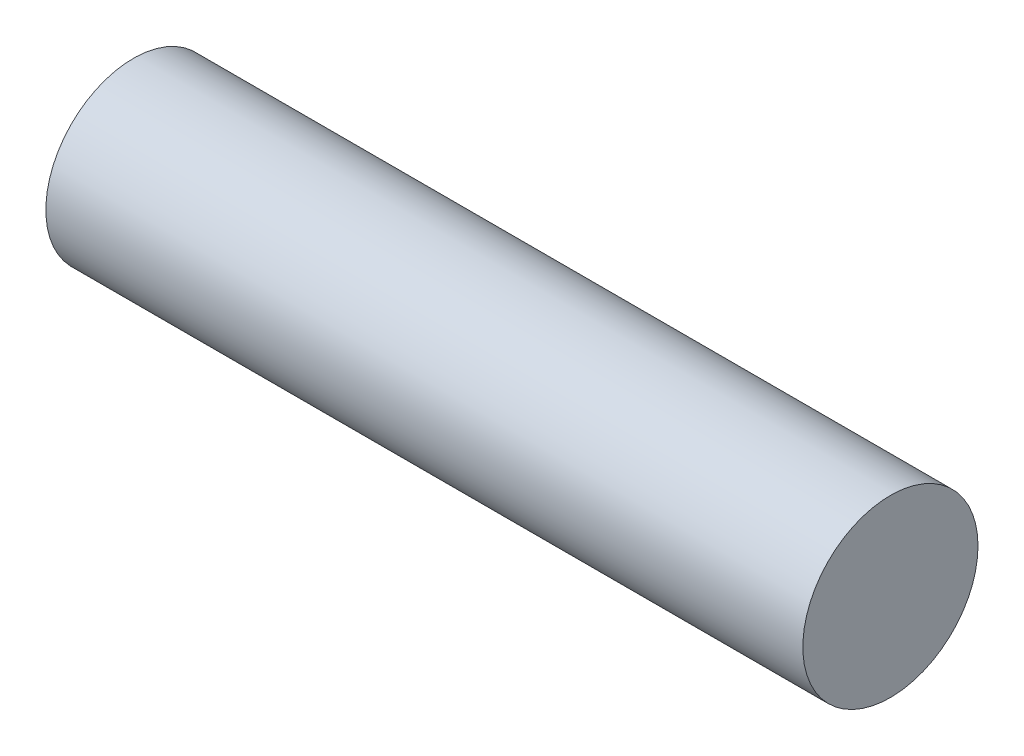
ISO-10303-21;
HEADER;
FILE_DESCRIPTION(('STEP AP214'),'2;1');
FILE_NAME('part.step','',(''),(''),'','','');
FILE_SCHEMA(('AUTOMOTIVE_DESIGN { 1 0 10303 214 1 1 1 1 }'));
ENDSEC;
DATA;
#1=APPLICATION_CONTEXT('core data for automotive mechanical design processes');
#2=APPLICATION_PROTOCOL_DEFINITION('international standard','automotive_design',2000,#1);
#3=PRODUCT_CONTEXT('',#1,'mechanical');
#4=PRODUCT('Part','Part','',(#3));
#5=PRODUCT_RELATED_PRODUCT_CATEGORY('part','',(#4));
#6=PRODUCT_DEFINITION_FORMATION('','',#4);
#7=PRODUCT_DEFINITION_CONTEXT('part definition',#1,'design');
#8=PRODUCT_DEFINITION('design','',#6,#7);
#9=PRODUCT_DEFINITION_SHAPE('','',#8);
#10=(LENGTH_UNIT() NAMED_UNIT(*) SI_UNIT(.MILLI.,.METRE.));
#11=(NAMED_UNIT(*) PLANE_ANGLE_UNIT() SI_UNIT($,.RADIAN.));
#12=(NAMED_UNIT(*) SI_UNIT($,.STERADIAN.) SOLID_ANGLE_UNIT());
#13=UNCERTAINTY_MEASURE_WITH_UNIT(LENGTH_MEASURE(1.E-05),#10,'distance_accuracy_value','');
#14=(GEOMETRIC_REPRESENTATION_CONTEXT(3) GLOBAL_UNCERTAINTY_ASSIGNED_CONTEXT((#13)) GLOBAL_UNIT_ASSIGNED_CONTEXT((#10,
#11,#12)) REPRESENTATION_CONTEXT('',''));
#15=CARTESIAN_POINT('',(0.,0.,0.));
#16=DIRECTION('',(0.,0.,1.));
#17=DIRECTION('',(1.,0.,0.));
#18=AXIS2_PLACEMENT_3D('',#15,#16,#17);
#19=CARTESIAN_POINT('',(43.,0.,0.));
#20=DIRECTION('',(-1.,0.,0.));
#21=DIRECTION('',(0.,0.,1.));
#22=AXIS2_PLACEMENT_3D('',#19,#20,#21);
#23=CYLINDRICAL_SURFACE('',#22,4.975);
#24=CARTESIAN_POINT('',(43.,0.,0.));
#25=DIRECTION('',(1.,0.,0.));
#26=DIRECTION('',(0.,0.,-1.));
#27=AXIS2_PLACEMENT_3D('',#24,#25,#26);
#28=CIRCLE('',#27,4.975);
#29=CARTESIAN_POINT('',(43.,0.,-4.975));
#30=VERTEX_POINT('',#29);
#31=EDGE_CURVE('E10',#30,#30,#28,.T.);
#32=ORIENTED_EDGE('',*,*,#31,.F.);
#33=EDGE_LOOP('',(#32));
#34=FACE_BOUND('',#33,.T.);
#35=CARTESIAN_POINT('',(0.,0.,0.));
#36=DIRECTION('',(1.,0.,0.));
#37=DIRECTION('',(0.,0.,-1.));
#38=AXIS2_PLACEMENT_3D('',#35,#36,#37);
#39=CIRCLE('',#38,4.975);
#40=CARTESIAN_POINT('',(0.,0.,-4.975));
#41=VERTEX_POINT('',#40);
#42=EDGE_CURVE('E40',#41,#41,#39,.T.);
#43=ORIENTED_EDGE('',*,*,#42,.T.);
#44=EDGE_LOOP('',(#43));
#45=FACE_BOUND('',#44,.T.);
#46=ADVANCED_FACE('F37',(#34,#45),#23,.T.);
#47=CARTESIAN_POINT('',(43.,0.,0.));
#48=DIRECTION('',(1.,0.,0.));
#49=DIRECTION('',(0.,0.,-1.));
#50=AXIS2_PLACEMENT_3D('',#47,#48,#49);
#51=PLANE('',#50);
#52=ORIENTED_EDGE('',*,*,#31,.T.);
#53=EDGE_LOOP('',(#52));
#54=FACE_BOUND('',#53,.T.);
#55=ADVANCED_FACE('F54',(#54),#51,.T.);
#56=CARTESIAN_POINT('',(0.,0.,0.));
#57=DIRECTION('',(1.,0.,0.));
#58=DIRECTION('',(0.,0.,-1.));
#59=AXIS2_PLACEMENT_3D('',#56,#57,#58);
#60=PLANE('',#59);
#61=ORIENTED_EDGE('',*,*,#42,.F.);
#62=EDGE_LOOP('',(#61));
#63=FACE_BOUND('',#62,.T.);
#64=ADVANCED_FACE('F52',(#63),#60,.F.);
#65=CLOSED_SHELL('',(#46,#55,#64));
#66=MANIFOLD_SOLID_BREP('B2',#65);
#67=ADVANCED_BREP_SHAPE_REPRESENTATION('',(#18,#66),#14);
#68=SHAPE_DEFINITION_REPRESENTATION(#9,#67);
ENDSEC;
END-ISO-10303-21;
